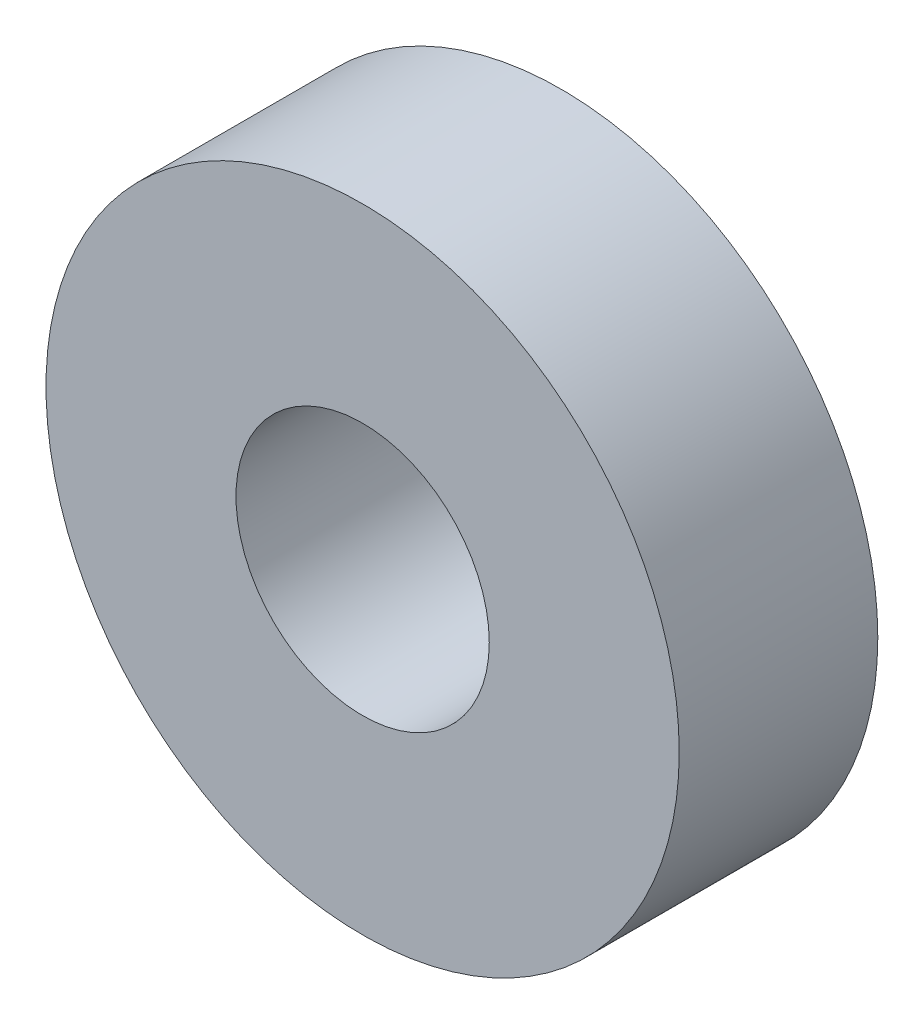
ISO-10303-21;
HEADER;
FILE_DESCRIPTION(('STEP AP214'),'2;1');
FILE_NAME('part.step','',(''),(''),'','','');
FILE_SCHEMA(('AUTOMOTIVE_DESIGN { 1 0 10303 214 1 1 1 1 }'));
ENDSEC;
DATA;
#1=APPLICATION_CONTEXT('core data for automotive mechanical design processes');
#2=APPLICATION_PROTOCOL_DEFINITION('international standard','automotive_design',2000,#1);
#3=PRODUCT_CONTEXT('',#1,'mechanical');
#4=PRODUCT('Part','Part','',(#3));
#5=PRODUCT_RELATED_PRODUCT_CATEGORY('part','',(#4));
#6=PRODUCT_DEFINITION_FORMATION('','',#4);
#7=PRODUCT_DEFINITION_CONTEXT('part definition',#1,'design');
#8=PRODUCT_DEFINITION('design','',#6,#7);
#9=PRODUCT_DEFINITION_SHAPE('','',#8);
#10=(LENGTH_UNIT() NAMED_UNIT(*) SI_UNIT(.MILLI.,.METRE.));
#11=(NAMED_UNIT(*) PLANE_ANGLE_UNIT() SI_UNIT($,.RADIAN.));
#12=(NAMED_UNIT(*) SI_UNIT($,.STERADIAN.) SOLID_ANGLE_UNIT());
#13=UNCERTAINTY_MEASURE_WITH_UNIT(LENGTH_MEASURE(1.E-05),#10,'distance_accuracy_value','');
#14=(GEOMETRIC_REPRESENTATION_CONTEXT(3) GLOBAL_UNCERTAINTY_ASSIGNED_CONTEXT((#13)) GLOBAL_UNIT_ASSIGNED_CONTEXT((#10,
#11,#12)) REPRESENTATION_CONTEXT('',''));
#15=CARTESIAN_POINT('',(0.,0.,0.));
#16=DIRECTION('',(0.,0.,1.));
#17=DIRECTION('',(1.,0.,0.));
#18=AXIS2_PLACEMENT_3D('',#15,#16,#17);
#19=CARTESIAN_POINT('',(0.,0.,4.9784));
#20=DIRECTION('',(0.,0.,1.));
#21=DIRECTION('',(1.,0.,0.));
#22=AXIS2_PLACEMENT_3D('',#19,#20,#21);
#23=PLANE('',#22);
#24=CARTESIAN_POINT('',(0.,0.,4.9784));
#25=DIRECTION('',(0.,0.,1.));
#26=DIRECTION('',(1.,0.,0.));
#27=AXIS2_PLACEMENT_3D('',#24,#25,#26);
#28=CIRCLE('',#27,7.9375);
#29=CARTESIAN_POINT('',(7.9375,0.,4.9784));
#30=VERTEX_POINT('',#29);
#31=EDGE_CURVE('E10',#30,#30,#28,.T.);
#32=ORIENTED_EDGE('',*,*,#31,.T.);
#33=EDGE_LOOP('',(#32));
#34=FACE_BOUND('',#33,.T.);
#35=CARTESIAN_POINT('',(0.,0.,4.9784));
#36=DIRECTION('',(0.,0.,1.));
#37=DIRECTION('',(1.,0.,0.));
#38=AXIS2_PLACEMENT_3D('',#35,#36,#37);
#39=CIRCLE('',#38,3.175);
#40=CARTESIAN_POINT('',(3.175,0.,4.9784));
#41=VERTEX_POINT('',#40);
#42=EDGE_CURVE('E44',#41,#41,#39,.T.);
#43=ORIENTED_EDGE('',*,*,#42,.F.);
#44=EDGE_LOOP('',(#43));
#45=FACE_BOUND('',#44,.T.);
#46=ADVANCED_FACE('F33',(#34,#45),#23,.T.);
#47=CARTESIAN_POINT('',(0.,0.,0.));
#48=DIRECTION('',(0.,0.,1.));
#49=DIRECTION('',(1.,0.,0.));
#50=AXIS2_PLACEMENT_3D('',#47,#48,#49);
#51=PLANE('',#50);
#52=CARTESIAN_POINT('',(0.,0.,0.));
#53=DIRECTION('',(0.,0.,1.));
#54=DIRECTION('',(1.,0.,0.));
#55=AXIS2_PLACEMENT_3D('',#52,#53,#54);
#56=CIRCLE('',#55,7.9375);
#57=CARTESIAN_POINT('',(7.9375,0.,0.));
#58=VERTEX_POINT('',#57);
#59=EDGE_CURVE('E37',#58,#58,#56,.T.);
#60=ORIENTED_EDGE('',*,*,#59,.F.);
#61=EDGE_LOOP('',(#60));
#62=FACE_BOUND('',#61,.T.);
#63=CARTESIAN_POINT('',(0.,0.,0.));
#64=DIRECTION('',(0.,0.,1.));
#65=DIRECTION('',(1.,0.,0.));
#66=AXIS2_PLACEMENT_3D('',#63,#64,#65);
#67=CIRCLE('',#66,3.175);
#68=CARTESIAN_POINT('',(3.175,0.,0.));
#69=VERTEX_POINT('',#68);
#70=EDGE_CURVE('E46',#69,#69,#67,.T.);
#71=ORIENTED_EDGE('',*,*,#70,.T.);
#72=EDGE_LOOP('',(#71));
#73=FACE_BOUND('',#72,.T.);
#74=ADVANCED_FACE('F56',(#62,#73),#51,.F.);
#75=CARTESIAN_POINT('',(0.,0.,4.9784));
#76=DIRECTION('',(0.,0.,-1.));
#77=DIRECTION('',(-1.,0.,0.));
#78=AXIS2_PLACEMENT_3D('',#75,#76,#77);
#79=CYLINDRICAL_SURFACE('',#78,7.9375);
#80=ORIENTED_EDGE('',*,*,#31,.F.);
#81=EDGE_LOOP('',(#80));
#82=FACE_BOUND('',#81,.T.);
#83=ORIENTED_EDGE('',*,*,#59,.T.);
#84=EDGE_LOOP('',(#83));
#85=FACE_BOUND('',#84,.T.);
#86=ADVANCED_FACE('F35',(#82,#85),#79,.T.);
#87=CARTESIAN_POINT('',(0.,0.,4.9784));
#88=DIRECTION('',(0.,0.,-1.));
#89=DIRECTION('',(-1.,0.,0.));
#90=AXIS2_PLACEMENT_3D('',#87,#88,#89);
#91=CYLINDRICAL_SURFACE('',#90,3.175);
#92=ORIENTED_EDGE('',*,*,#42,.T.);
#93=EDGE_LOOP('',(#92));
#94=FACE_BOUND('',#93,.T.);
#95=ORIENTED_EDGE('',*,*,#70,.F.);
#96=EDGE_LOOP('',(#95));
#97=FACE_BOUND('',#96,.T.);
#98=ADVANCED_FACE('F52',(#94,#97),#91,.F.);
#99=CLOSED_SHELL('',(#46,#74,#86,#98));
#100=MANIFOLD_SOLID_BREP('B2',#99);
#101=ADVANCED_BREP_SHAPE_REPRESENTATION('',(#18,#100),#14);
#102=SHAPE_DEFINITION_REPRESENTATION(#9,#101);
ENDSEC;
END-ISO-10303-21;
